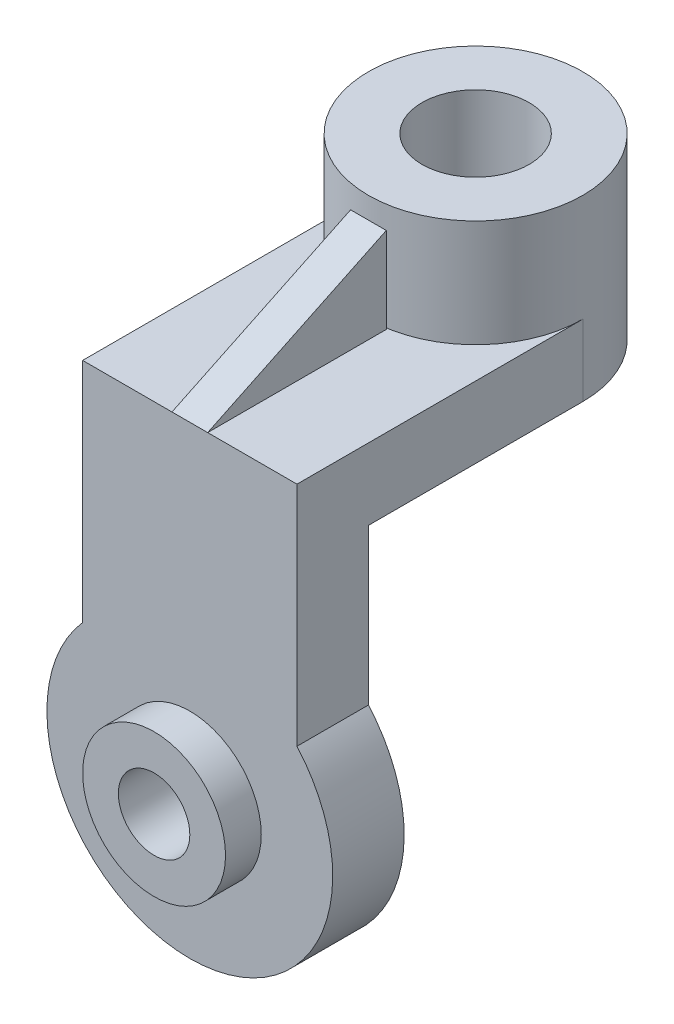
ISO-10303-21;
HEADER;
FILE_DESCRIPTION(('STEP AP214'),'2;1');
FILE_NAME('part.step','',(''),(''),'','','');
FILE_SCHEMA(('AUTOMOTIVE_DESIGN { 1 0 10303 214 1 1 1 1 }'));
ENDSEC;
DATA;
#1=APPLICATION_CONTEXT('core data for automotive mechanical design processes');
#2=APPLICATION_PROTOCOL_DEFINITION('international standard','automotive_design',2000,#1);
#3=PRODUCT_CONTEXT('',#1,'mechanical');
#4=PRODUCT('Part','Part','',(#3));
#5=PRODUCT_RELATED_PRODUCT_CATEGORY('part','',(#4));
#6=PRODUCT_DEFINITION_FORMATION('','',#4);
#7=PRODUCT_DEFINITION_CONTEXT('part definition',#1,'design');
#8=PRODUCT_DEFINITION('design','',#6,#7);
#9=PRODUCT_DEFINITION_SHAPE('','',#8);
#10=(LENGTH_UNIT() NAMED_UNIT(*) SI_UNIT(.MILLI.,.METRE.));
#11=(NAMED_UNIT(*) PLANE_ANGLE_UNIT() SI_UNIT($,.RADIAN.));
#12=(NAMED_UNIT(*) SI_UNIT($,.STERADIAN.) SOLID_ANGLE_UNIT());
#13=UNCERTAINTY_MEASURE_WITH_UNIT(LENGTH_MEASURE(1.E-05),#10,'distance_accuracy_value','');
#14=(GEOMETRIC_REPRESENTATION_CONTEXT(3) GLOBAL_UNCERTAINTY_ASSIGNED_CONTEXT((#13)) GLOBAL_UNIT_ASSIGNED_CONTEXT((#10,
#11,#12)) REPRESENTATION_CONTEXT('',''));
#15=CARTESIAN_POINT('',(0.,0.,0.));
#16=DIRECTION('',(0.,0.,1.));
#17=DIRECTION('',(1.,0.,0.));
#18=AXIS2_PLACEMENT_3D('',#15,#16,#17);
#19=CARTESIAN_POINT('',(17.5,12.0286085825748,5.77373211963589));
#20=DIRECTION('',(0.,0.901523057468274,0.432731067584771));
#21=DIRECTION('',(0.,-0.432731067584771,0.901523057468274));
#22=AXIS2_PLACEMENT_3D('',#19,#20,#21);
#23=PLANE('',#22);
#24=DIRECTION('',(0.,0.432731067584771,-0.901523057468274));
#25=VECTOR('',#24,1.);
#26=CARTESIAN_POINT('',(12.5,12.0286085825748,5.77373211963589));
#27=LINE('',#26,#25);
#28=CARTESIAN_POINT('',(12.5,10.,10.));
#29=VERTEX_POINT('',#28);
#30=CARTESIAN_POINT('',(12.5,22.,-15.));
#31=VERTEX_POINT('',#30);
#32=EDGE_CURVE('E87',#29,#31,#27,.T.);
#33=ORIENTED_EDGE('',*,*,#32,.F.);
#34=DIRECTION('',(-1.,0.,0.));
#35=VECTOR('',#34,1.);
#36=CARTESIAN_POINT('',(17.5,10.,10.));
#37=LINE('',#36,#35);
#38=CARTESIAN_POINT('',(17.5,10.,10.));
#39=VERTEX_POINT('',#38);
#40=EDGE_CURVE('E12',#39,#29,#37,.T.);
#41=ORIENTED_EDGE('',*,*,#40,.F.);
#42=DIRECTION('',(0.,0.432731067584771,-0.901523057468274));
#43=VECTOR('',#42,1.);
#44=CARTESIAN_POINT('',(17.5,12.0286085825748,5.77373211963589));
#45=LINE('',#44,#43);
#46=CARTESIAN_POINT('',(17.5,22.,-15.));
#47=VERTEX_POINT('',#46);
#48=EDGE_CURVE('E85',#39,#47,#45,.T.);
#49=ORIENTED_EDGE('',*,*,#48,.T.);
#50=DIRECTION('',(-1.,0.,0.));
#51=VECTOR('',#50,1.);
#52=CARTESIAN_POINT('',(17.5,22.,-15.));
#53=LINE('',#52,#51);
#54=EDGE_CURVE('E69',#47,#31,#53,.T.);
#55=ORIENTED_EDGE('',*,*,#54,.T.);
#56=EDGE_LOOP('',(#33,#41,#49,#55));
#57=FACE_BOUND('',#56,.T.);
#58=ADVANCED_FACE('F53',(#57),#23,.T.);
#59=CARTESIAN_POINT('',(17.5,10.,0.));
#60=DIRECTION('',(0.,-1.,0.));
#61=DIRECTION('',(0.,0.,-1.));
#62=AXIS2_PLACEMENT_3D('',#59,#60,#61);
#63=PLANE('',#62);
#64=DIRECTION('',(0.,0.,1.));
#65=VECTOR('',#64,1.);
#66=CARTESIAN_POINT('',(12.5,10.,0.));
#67=LINE('',#66,#65);
#68=CARTESIAN_POINT('',(12.5,10.,-15.));
#69=VERTEX_POINT('',#68);
#70=EDGE_CURVE('E103',#69,#29,#67,.T.);
#71=ORIENTED_EDGE('',*,*,#70,.F.);
#72=DIRECTION('',(-1.,0.,0.));
#73=VECTOR('',#72,1.);
#74=CARTESIAN_POINT('',(17.5,10.,-15.));
#75=LINE('',#74,#73);
#76=CARTESIAN_POINT('',(17.5,10.,-15.));
#77=VERTEX_POINT('',#76);
#78=EDGE_CURVE('E61',#77,#69,#75,.T.);
#79=ORIENTED_EDGE('',*,*,#78,.F.);
#80=DIRECTION('',(0.,0.,1.));
#81=VECTOR('',#80,1.);
#82=CARTESIAN_POINT('',(17.5,10.,0.));
#83=LINE('',#82,#81);
#84=EDGE_CURVE('E94',#77,#39,#83,.T.);
#85=ORIENTED_EDGE('',*,*,#84,.T.);
#86=ORIENTED_EDGE('',*,*,#40,.T.);
#87=EDGE_LOOP('',(#71,#79,#85,#86));
#88=FACE_BOUND('',#87,.T.);
#89=ADVANCED_FACE('F98',(#88),#63,.T.);
#90=CARTESIAN_POINT('',(17.5,0.,-15.));
#91=DIRECTION('',(0.,0.,-1.));
#92=DIRECTION('',(0.,1.,0.));
#93=AXIS2_PLACEMENT_3D('',#90,#91,#92);
#94=PLANE('',#93);
#95=DIRECTION('',(0.,-1.,0.));
#96=VECTOR('',#95,1.);
#97=CARTESIAN_POINT('',(12.5,0.,-15.));
#98=LINE('',#97,#96);
#99=EDGE_CURVE('E96',#31,#69,#98,.T.);
#100=ORIENTED_EDGE('',*,*,#99,.F.);
#101=ORIENTED_EDGE('',*,*,#54,.F.);
#102=DIRECTION('',(0.,-1.,0.));
#103=VECTOR('',#102,1.);
#104=CARTESIAN_POINT('',(17.5,0.,-15.));
#105=LINE('',#104,#103);
#106=EDGE_CURVE('E95',#47,#77,#105,.T.);
#107=ORIENTED_EDGE('',*,*,#106,.T.);
#108=ORIENTED_EDGE('',*,*,#78,.T.);
#109=EDGE_LOOP('',(#100,#101,#107,#108));
#110=FACE_BOUND('',#109,.T.);
#111=ADVANCED_FACE('F109',(#110),#94,.T.);
#112=CARTESIAN_POINT('',(17.5,0.,0.));
#113=DIRECTION('',(1.,0.,0.));
#114=DIRECTION('',(0.,0.,-1.));
#115=AXIS2_PLACEMENT_3D('',#112,#113,#114);
#116=PLANE('',#115);
#117=ORIENTED_EDGE('',*,*,#48,.F.);
#118=ORIENTED_EDGE('',*,*,#84,.F.);
#119=ORIENTED_EDGE('',*,*,#106,.F.);
#120=EDGE_LOOP('',(#117,#118,#119));
#121=FACE_BOUND('',#120,.T.);
#122=ADVANCED_FACE('F93',(#121),#116,.T.);
#123=CARTESIAN_POINT('',(12.5,0.,0.));
#124=DIRECTION('',(1.,0.,0.));
#125=DIRECTION('',(0.,0.,-1.));
#126=AXIS2_PLACEMENT_3D('',#123,#124,#125);
#127=PLANE('',#126);
#128=ORIENTED_EDGE('',*,*,#32,.T.);
#129=ORIENTED_EDGE('',*,*,#99,.T.);
#130=ORIENTED_EDGE('',*,*,#70,.T.);
#131=EDGE_LOOP('',(#128,#129,#130));
#132=FACE_BOUND('',#131,.T.);
#133=ADVANCED_FACE('F108',(#132),#127,.F.);
#134=CLOSED_SHELL('',(#58,#89,#111,#122,#133));
#135=MANIFOLD_SOLID_BREP('B2',#134);
#136=CARTESIAN_POINT('',(15.,-35.,10.));
#137=DIRECTION('',(0.,0.,-1.));
#138=DIRECTION('',(-1.,0.,0.));
#139=AXIS2_PLACEMENT_3D('',#136,#137,#138);
#140=CYLINDRICAL_SURFACE('',#139,20.);
#141=CARTESIAN_POINT('',(15.,-35.,0.));
#142=DIRECTION('',(0.,0.,1.));
#143=DIRECTION('',(1.,0.,0.));
#144=AXIS2_PLACEMENT_3D('',#141,#142,#143);
#145=CIRCLE('',#144,20.);
#146=CARTESIAN_POINT('',(0.,-21.7712434446771,0.));
#147=VERTEX_POINT('',#146);
#148=CARTESIAN_POINT('',(30.,-21.771243444677,0.));
#149=VERTEX_POINT('',#148);
#150=EDGE_CURVE('E205',#147,#149,#145,.T.);
#151=ORIENTED_EDGE('',*,*,#150,.T.);
#152=DIRECTION('',(0.,0.,-1.));
#153=VECTOR('',#152,1.);
#154=CARTESIAN_POINT('',(30.,-21.771243444677,10.));
#155=LINE('',#154,#153);
#156=CARTESIAN_POINT('',(30.,-21.771243444677,10.));
#157=VERTEX_POINT('',#156);
#158=EDGE_CURVE('E51',#157,#149,#155,.T.);
#159=ORIENTED_EDGE('',*,*,#158,.F.);
#160=CARTESIAN_POINT('',(15.,-35.,10.));
#161=DIRECTION('',(0.,0.,1.));
#162=DIRECTION('',(1.,0.,0.));
#163=AXIS2_PLACEMENT_3D('',#160,#161,#162);
#164=CIRCLE('',#163,20.);
#165=CARTESIAN_POINT('',(0.,-21.7712434446771,10.));
#166=VERTEX_POINT('',#165);
#167=EDGE_CURVE('E207',#166,#157,#164,.T.);
#168=ORIENTED_EDGE('',*,*,#167,.F.);
#169=DIRECTION('',(0.,0.,-1.));
#170=VECTOR('',#169,1.);
#171=CARTESIAN_POINT('',(0.,-21.7712434446771,10.));
#172=LINE('',#171,#170);
#173=EDGE_CURVE('E162',#166,#147,#172,.T.);
#174=ORIENTED_EDGE('',*,*,#173,.T.);
#175=EDGE_LOOP('',(#151,#159,#168,#174));
#176=FACE_BOUND('',#175,.T.);
#177=ADVANCED_FACE('F154',(#176),#140,.T.);
#178=CARTESIAN_POINT('',(30.,0.,10.));
#179=DIRECTION('',(1.,0.,0.));
#180=DIRECTION('',(0.,0.,-1.));
#181=AXIS2_PLACEMENT_3D('',#178,#179,#180);
#182=PLANE('',#181);
#183=DIRECTION('',(0.,-1.,0.));
#184=VECTOR('',#183,1.);
#185=CARTESIAN_POINT('',(30.,0.,0.));
#186=LINE('',#185,#184);
#187=CARTESIAN_POINT('',(30.,0.,0.));
#188=VERTEX_POINT('',#187);
#189=EDGE_CURVE('E209',#188,#149,#186,.T.);
#190=ORIENTED_EDGE('',*,*,#189,.F.);
#191=DIRECTION('',(0.,0.,-1.));
#192=VECTOR('',#191,1.);
#193=CARTESIAN_POINT('',(30.,0.,0.));
#194=LINE('',#193,#192);
#195=CARTESIAN_POINT('',(30.,0.,-30.));
#196=VERTEX_POINT('',#195);
#197=EDGE_CURVE('E183',#188,#196,#194,.T.);
#198=ORIENTED_EDGE('',*,*,#197,.T.);
#199=DIRECTION('',(0.,-1.,0.));
#200=VECTOR('',#199,1.);
#201=CARTESIAN_POINT('',(30.,10.,-30.));
#202=LINE('',#201,#200);
#203=CARTESIAN_POINT('',(30.,10.,-30.));
#204=VERTEX_POINT('',#203);
#205=EDGE_CURVE('E245',#204,#196,#202,.T.);
#206=ORIENTED_EDGE('',*,*,#205,.F.);
#207=DIRECTION('',(0.,0.,-1.));
#208=VECTOR('',#207,1.);
#209=CARTESIAN_POINT('',(30.,10.,0.));
#210=LINE('',#209,#208);
#211=CARTESIAN_POINT('',(30.,10.,10.));
#212=VERTEX_POINT('',#211);
#213=EDGE_CURVE('E264',#212,#204,#210,.T.);
#214=ORIENTED_EDGE('',*,*,#213,.F.);
#215=DIRECTION('',(0.,-1.,0.));
#216=VECTOR('',#215,1.);
#217=CARTESIAN_POINT('',(30.,0.,10.));
#218=LINE('',#217,#216);
#219=EDGE_CURVE('E284',#212,#157,#218,.T.);
#220=ORIENTED_EDGE('',*,*,#219,.T.);
#221=ORIENTED_EDGE('',*,*,#158,.T.);
#222=EDGE_LOOP('',(#190,#198,#206,#214,#220,#221));
#223=FACE_BOUND('',#222,.T.);
#224=ADVANCED_FACE('F288',(#223),#182,.T.);
#225=CARTESIAN_POINT('',(0.,0.,10.));
#226=DIRECTION('',(1.,0.,0.));
#227=DIRECTION('',(0.,0.,-1.));
#228=AXIS2_PLACEMENT_3D('',#225,#226,#227);
#229=PLANE('',#228);
#230=DIRECTION('',(0.,-1.,0.));
#231=VECTOR('',#230,1.);
#232=CARTESIAN_POINT('',(0.,0.,0.));
#233=LINE('',#232,#231);
#234=CARTESIAN_POINT('',(0.,0.,0.));
#235=VERTEX_POINT('',#234);
#236=EDGE_CURVE('E189',#235,#147,#233,.T.);
#237=ORIENTED_EDGE('',*,*,#236,.T.);
#238=ORIENTED_EDGE('',*,*,#173,.F.);
#239=DIRECTION('',(0.,-1.,0.));
#240=VECTOR('',#239,1.);
#241=CARTESIAN_POINT('',(0.,0.,10.));
#242=LINE('',#241,#240);
#243=CARTESIAN_POINT('',(0.,10.,10.));
#244=VERTEX_POINT('',#243);
#245=EDGE_CURVE('E170',#244,#166,#242,.T.);
#246=ORIENTED_EDGE('',*,*,#245,.F.);
#247=DIRECTION('',(0.,0.,-1.));
#248=VECTOR('',#247,1.);
#249=CARTESIAN_POINT('',(0.,10.,0.));
#250=LINE('',#249,#248);
#251=CARTESIAN_POINT('',(0.,10.,-30.));
#252=VERTEX_POINT('',#251);
#253=EDGE_CURVE('E258',#244,#252,#250,.T.);
#254=ORIENTED_EDGE('',*,*,#253,.T.);
#255=DIRECTION('',(0.,-1.,0.));
#256=VECTOR('',#255,1.);
#257=CARTESIAN_POINT('',(0.,10.,-30.));
#258=LINE('',#257,#256);
#259=CARTESIAN_POINT('',(0.,0.,-30.));
#260=VERTEX_POINT('',#259);
#261=EDGE_CURVE('E242',#252,#260,#258,.T.);
#262=ORIENTED_EDGE('',*,*,#261,.T.);
#263=DIRECTION('',(0.,0.,-1.));
#264=VECTOR('',#263,1.);
#265=CARTESIAN_POINT('',(0.,0.,0.));
#266=LINE('',#265,#264);
#267=EDGE_CURVE('E195',#235,#260,#266,.T.);
#268=ORIENTED_EDGE('',*,*,#267,.F.);
#269=EDGE_LOOP('',(#237,#238,#246,#254,#262,#268));
#270=FACE_BOUND('',#269,.T.);
#271=ADVANCED_FACE('F191',(#270),#229,.F.);
#272=CARTESIAN_POINT('',(0.,0.,10.));
#273=DIRECTION('',(0.,0.,1.));
#274=DIRECTION('',(1.,0.,0.));
#275=AXIS2_PLACEMENT_3D('',#272,#273,#274);
#276=PLANE('',#275);
#277=CARTESIAN_POINT('',(15.,-35.,10.));
#278=DIRECTION('',(0.,0.,1.));
#279=DIRECTION('',(1.,0.,0.));
#280=AXIS2_PLACEMENT_3D('',#277,#278,#279);
#281=CIRCLE('',#280,10.);
#282=CARTESIAN_POINT('',(25.,-35.,10.));
#283=VERTEX_POINT('',#282);
#284=EDGE_CURVE('E199',#283,#283,#281,.T.);
#285=ORIENTED_EDGE('',*,*,#284,.F.);
#286=EDGE_LOOP('',(#285));
#287=FACE_BOUND('',#286,.T.);
#288=ORIENTED_EDGE('',*,*,#167,.T.);
#289=ORIENTED_EDGE('',*,*,#219,.F.);
#290=DIRECTION('',(1.,0.,0.));
#291=VECTOR('',#290,1.);
#292=CARTESIAN_POINT('',(0.,10.,10.));
#293=LINE('',#292,#291);
#294=EDGE_CURVE('E261',#244,#212,#293,.T.);
#295=ORIENTED_EDGE('',*,*,#294,.F.);
#296=ORIENTED_EDGE('',*,*,#245,.T.);
#297=EDGE_LOOP('',(#288,#289,#295,#296));
#298=FACE_BOUND('',#297,.T.);
#299=ADVANCED_FACE('F289',(#287,#298),#276,.T.);
#300=CARTESIAN_POINT('',(0.,0.,0.));
#301=DIRECTION('',(0.,0.,1.));
#302=DIRECTION('',(1.,0.,0.));
#303=AXIS2_PLACEMENT_3D('',#300,#301,#302);
#304=PLANE('',#303);
#305=CARTESIAN_POINT('',(15.,-35.,0.));
#306=DIRECTION('',(0.,0.,1.));
#307=DIRECTION('',(1.,0.,0.));
#308=AXIS2_PLACEMENT_3D('',#305,#306,#307);
#309=CIRCLE('',#308,10.);
#310=CARTESIAN_POINT('',(25.,-35.,0.));
#311=VERTEX_POINT('',#310);
#312=EDGE_CURVE('E210',#311,#311,#309,.T.);
#313=ORIENTED_EDGE('',*,*,#312,.T.);
#314=EDGE_LOOP('',(#313));
#315=FACE_BOUND('',#314,.T.);
#316=ORIENTED_EDGE('',*,*,#150,.F.);
#317=ORIENTED_EDGE('',*,*,#236,.F.);
#318=DIRECTION('',(1.,0.,0.));
#319=VECTOR('',#318,1.);
#320=CARTESIAN_POINT('',(0.,0.,0.));
#321=LINE('',#320,#319);
#322=EDGE_CURVE('E200',#235,#188,#321,.T.);
#323=ORIENTED_EDGE('',*,*,#322,.T.);
#324=ORIENTED_EDGE('',*,*,#189,.T.);
#325=EDGE_LOOP('',(#316,#317,#323,#324));
#326=FACE_BOUND('',#325,.T.);
#327=ADVANCED_FACE('F208',(#315,#326),#304,.F.);
#328=CARTESIAN_POINT('',(15.,-35.,-5.));
#329=DIRECTION('',(0.,0.,1.));
#330=DIRECTION('',(1.,0.,0.));
#331=AXIS2_PLACEMENT_3D('',#328,#329,#330);
#332=CYLINDRICAL_SURFACE('',#331,10.);
#333=CARTESIAN_POINT('',(15.,-35.,-5.));
#334=DIRECTION('',(0.,0.,1.));
#335=DIRECTION('',(1.,0.,0.));
#336=AXIS2_PLACEMENT_3D('',#333,#334,#335);
#337=CIRCLE('',#336,10.);
#338=CARTESIAN_POINT('',(25.,-35.,-5.));
#339=VERTEX_POINT('',#338);
#340=EDGE_CURVE('E214',#339,#339,#337,.T.);
#341=ORIENTED_EDGE('',*,*,#340,.T.);
#342=EDGE_LOOP('',(#341));
#343=FACE_BOUND('',#342,.T.);
#344=ORIENTED_EDGE('',*,*,#312,.F.);
#345=EDGE_LOOP('',(#344));
#346=FACE_BOUND('',#345,.T.);
#347=ADVANCED_FACE('F318',(#343,#346),#332,.T.);
#348=CARTESIAN_POINT('',(15.,-35.,-5.));
#349=DIRECTION('',(0.,0.,1.));
#350=DIRECTION('',(1.,0.,0.));
#351=AXIS2_PLACEMENT_3D('',#348,#349,#350);
#352=CYLINDRICAL_SURFACE('',#351,5.);
#353=CARTESIAN_POINT('',(15.,-35.,-5.));
#354=DIRECTION('',(0.,0.,1.));
#355=DIRECTION('',(1.,0.,0.));
#356=AXIS2_PLACEMENT_3D('',#353,#354,#355);
#357=CIRCLE('',#356,5.);
#358=CARTESIAN_POINT('',(20.,-35.,-5.));
#359=VERTEX_POINT('',#358);
#360=EDGE_CURVE('E277',#359,#359,#357,.T.);
#361=ORIENTED_EDGE('',*,*,#360,.F.);
#362=EDGE_LOOP('',(#361));
#363=FACE_BOUND('',#362,.T.);
#364=CARTESIAN_POINT('',(15.,-35.,15.));
#365=DIRECTION('',(0.,0.,1.));
#366=DIRECTION('',(1.,0.,0.));
#367=AXIS2_PLACEMENT_3D('',#364,#365,#366);
#368=CIRCLE('',#367,5.);
#369=CARTESIAN_POINT('',(20.,-35.,15.));
#370=VERTEX_POINT('',#369);
#371=EDGE_CURVE('E271',#370,#370,#368,.T.);
#372=ORIENTED_EDGE('',*,*,#371,.T.);
#373=EDGE_LOOP('',(#372));
#374=FACE_BOUND('',#373,.T.);
#375=ADVANCED_FACE('F323',(#363,#374),#352,.F.);
#376=ORIENTED_EDGE('',*,*,#284,.T.);
#377=EDGE_LOOP('',(#376));
#378=FACE_BOUND('',#377,.T.);
#379=CARTESIAN_POINT('',(15.,-35.,15.));
#380=DIRECTION('',(0.,0.,1.));
#381=DIRECTION('',(1.,0.,0.));
#382=AXIS2_PLACEMENT_3D('',#379,#380,#381);
#383=CIRCLE('',#382,10.);
#384=CARTESIAN_POINT('',(25.,-35.,15.));
#385=VERTEX_POINT('',#384);
#386=EDGE_CURVE('E274',#385,#385,#383,.T.);
#387=ORIENTED_EDGE('',*,*,#386,.F.);
#388=EDGE_LOOP('',(#387));
#389=FACE_BOUND('',#388,.T.);
#390=ADVANCED_FACE('F326',(#378,#389),#332,.T.);
#391=CARTESIAN_POINT('',(0.,0.,-5.));
#392=DIRECTION('',(0.,0.,1.));
#393=DIRECTION('',(1.,0.,0.));
#394=AXIS2_PLACEMENT_3D('',#391,#392,#393);
#395=PLANE('',#394);
#396=ORIENTED_EDGE('',*,*,#360,.T.);
#397=EDGE_LOOP('',(#396));
#398=FACE_BOUND('',#397,.T.);
#399=ORIENTED_EDGE('',*,*,#340,.F.);
#400=EDGE_LOOP('',(#399));
#401=FACE_BOUND('',#400,.T.);
#402=ADVANCED_FACE('F303',(#398,#401),#395,.F.);
#403=CARTESIAN_POINT('',(0.,0.,15.));
#404=DIRECTION('',(0.,0.,1.));
#405=DIRECTION('',(1.,0.,0.));
#406=AXIS2_PLACEMENT_3D('',#403,#404,#405);
#407=PLANE('',#406);
#408=ORIENTED_EDGE('',*,*,#371,.F.);
#409=EDGE_LOOP('',(#408));
#410=FACE_BOUND('',#409,.T.);
#411=ORIENTED_EDGE('',*,*,#386,.T.);
#412=EDGE_LOOP('',(#411));
#413=FACE_BOUND('',#412,.T.);
#414=ADVANCED_FACE('F294',(#410,#413),#407,.T.);
#415=CARTESIAN_POINT('',(0.,10.,0.));
#416=DIRECTION('',(0.,1.,0.));
#417=DIRECTION('',(0.,0.,1.));
#418=AXIS2_PLACEMENT_3D('',#415,#416,#417);
#419=PLANE('',#418);
#420=CARTESIAN_POINT('',(15.,10.,-30.));
#421=DIRECTION('',(0.,1.,0.));
#422=DIRECTION('',(0.,0.,1.));
#423=AXIS2_PLACEMENT_3D('',#420,#421,#422);
#424=CIRCLE('',#423,15.);
#425=EDGE_CURVE('E256',#252,#204,#424,.T.);
#426=ORIENTED_EDGE('',*,*,#425,.F.);
#427=ORIENTED_EDGE('',*,*,#253,.F.);
#428=ORIENTED_EDGE('',*,*,#294,.T.);
#429=ORIENTED_EDGE('',*,*,#213,.T.);
#430=EDGE_LOOP('',(#426,#427,#428,#429));
#431=FACE_BOUND('',#430,.T.);
#432=ADVANCED_FACE('F292',(#431),#419,.T.);
#433=CARTESIAN_POINT('',(0.,0.,0.));
#434=DIRECTION('',(0.,1.,0.));
#435=DIRECTION('',(0.,0.,1.));
#436=AXIS2_PLACEMENT_3D('',#433,#434,#435);
#437=PLANE('',#436);
#438=ORIENTED_EDGE('',*,*,#322,.F.);
#439=ORIENTED_EDGE('',*,*,#267,.T.);
#440=CARTESIAN_POINT('',(15.,0.,-30.));
#441=DIRECTION('',(0.,1.,0.));
#442=DIRECTION('',(0.,0.,1.));
#443=AXIS2_PLACEMENT_3D('',#440,#441,#442);
#444=CIRCLE('',#443,15.);
#445=EDGE_CURVE('E239',#196,#260,#444,.T.);
#446=ORIENTED_EDGE('',*,*,#445,.F.);
#447=ORIENTED_EDGE('',*,*,#197,.F.);
#448=EDGE_LOOP('',(#438,#439,#446,#447));
#449=FACE_BOUND('',#448,.T.);
#450=CARTESIAN_POINT('',(15.,0.,-30.));
#451=DIRECTION('',(0.,1.,0.));
#452=DIRECTION('',(0.,0.,1.));
#453=AXIS2_PLACEMENT_3D('',#450,#451,#452);
#454=CIRCLE('',#453,7.5);
#455=CARTESIAN_POINT('',(15.,0.,-22.5));
#456=VERTEX_POINT('',#455);
#457=EDGE_CURVE('E247',#456,#456,#454,.T.);
#458=ORIENTED_EDGE('',*,*,#457,.T.);
#459=EDGE_LOOP('',(#458));
#460=FACE_BOUND('',#459,.T.);
#461=ADVANCED_FACE('F219',(#449,#460),#437,.F.);
#462=CARTESIAN_POINT('',(15.,25.,-30.));
#463=DIRECTION('',(0.,-1.,0.));
#464=DIRECTION('',(0.,0.,-1.));
#465=AXIS2_PLACEMENT_3D('',#462,#463,#464);
#466=CYLINDRICAL_SURFACE('',#465,7.5);
#467=CARTESIAN_POINT('',(15.,25.,-30.));
#468=DIRECTION('',(0.,1.,0.));
#469=DIRECTION('',(0.,0.,1.));
#470=AXIS2_PLACEMENT_3D('',#467,#468,#469);
#471=CIRCLE('',#470,7.5);
#472=CARTESIAN_POINT('',(15.,25.,-22.5));
#473=VERTEX_POINT('',#472);
#474=EDGE_CURVE('E246',#473,#473,#471,.T.);
#475=ORIENTED_EDGE('',*,*,#474,.T.);
#476=EDGE_LOOP('',(#475));
#477=FACE_BOUND('',#476,.T.);
#478=ORIENTED_EDGE('',*,*,#457,.F.);
#479=EDGE_LOOP('',(#478));
#480=FACE_BOUND('',#479,.T.);
#481=ADVANCED_FACE('F300',(#477,#480),#466,.F.);
#482=CARTESIAN_POINT('',(15.,25.,-30.));
#483=DIRECTION('',(0.,-1.,0.));
#484=DIRECTION('',(0.,0.,-1.));
#485=AXIS2_PLACEMENT_3D('',#482,#483,#484);
#486=CYLINDRICAL_SURFACE('',#485,15.);
#487=ORIENTED_EDGE('',*,*,#205,.T.);
#488=ORIENTED_EDGE('',*,*,#445,.T.);
#489=ORIENTED_EDGE('',*,*,#261,.F.);
#490=ORIENTED_EDGE('',*,*,#425,.T.);
#491=EDGE_LOOP('',(#487,#488,#489,#490));
#492=FACE_BOUND('',#491,.T.);
#493=CARTESIAN_POINT('',(15.,25.,-30.));
#494=DIRECTION('',(0.,1.,0.));
#495=DIRECTION('',(0.,0.,1.));
#496=AXIS2_PLACEMENT_3D('',#493,#494,#495);
#497=CIRCLE('',#496,15.);
#498=CARTESIAN_POINT('',(15.,25.,-15.));
#499=VERTEX_POINT('',#498);
#500=EDGE_CURVE('E250',#499,#499,#497,.T.);
#501=ORIENTED_EDGE('',*,*,#500,.F.);
#502=EDGE_LOOP('',(#501));
#503=FACE_BOUND('',#502,.T.);
#504=ADVANCED_FACE('F240',(#492,#503),#486,.T.);
#505=CARTESIAN_POINT('',(0.,25.,0.));
#506=DIRECTION('',(0.,1.,0.));
#507=DIRECTION('',(0.,0.,1.));
#508=AXIS2_PLACEMENT_3D('',#505,#506,#507);
#509=PLANE('',#508);
#510=ORIENTED_EDGE('',*,*,#474,.F.);
#511=EDGE_LOOP('',(#510));
#512=FACE_BOUND('',#511,.T.);
#513=ORIENTED_EDGE('',*,*,#500,.T.);
#514=EDGE_LOOP('',(#513));
#515=FACE_BOUND('',#514,.T.);
#516=ADVANCED_FACE('F437',(#512,#515),#509,.T.);
#517=CLOSED_SHELL('',(#177,#224,#271,#299,#327,#347,#375,#390,#402,#414,#432,#461,#481,#504,#516));
#518=MANIFOLD_SOLID_BREP('B6',#517);
#519=ADVANCED_BREP_SHAPE_REPRESENTATION('',(#18,#135,#518),#14);
#520=SHAPE_DEFINITION_REPRESENTATION(#9,#519);
ENDSEC;
END-ISO-10303-21;
